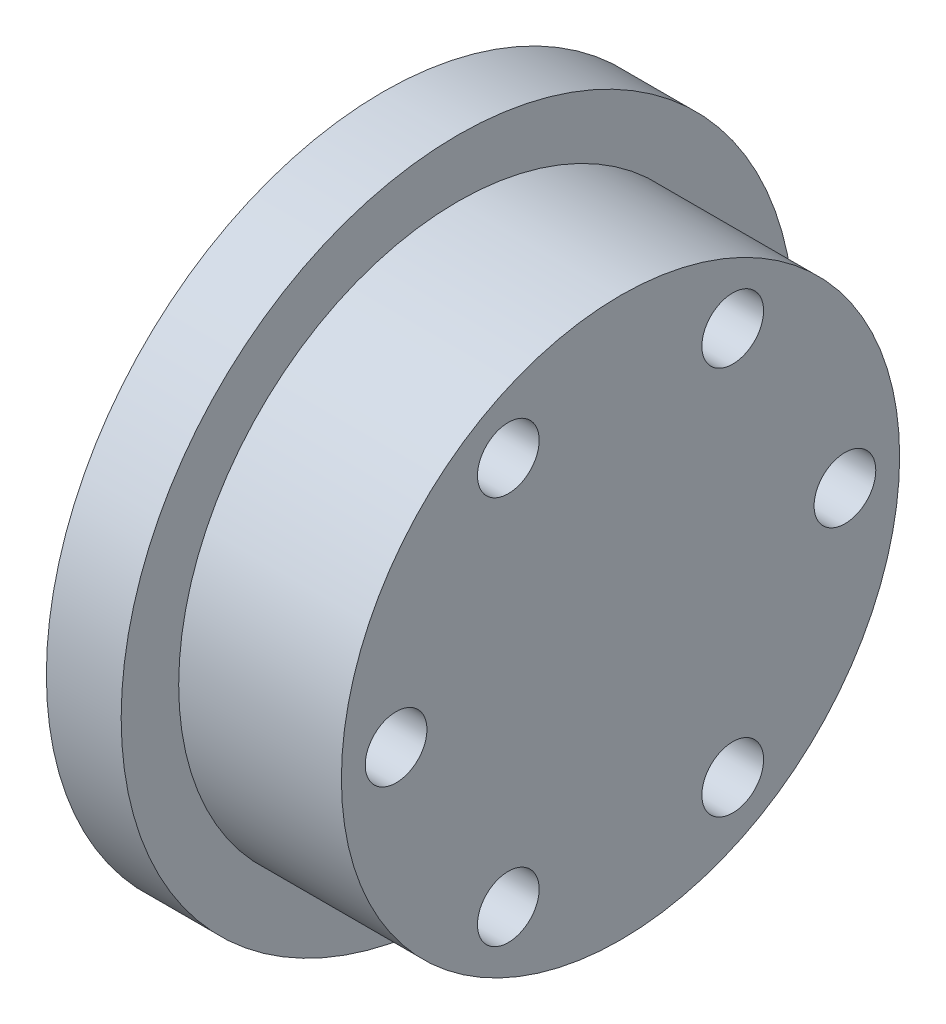
ISO-10303-21;
HEADER;
FILE_DESCRIPTION(('STEP AP214'),'2;1');
FILE_NAME('part.step','',(''),(''),'','','');
FILE_SCHEMA(('AUTOMOTIVE_DESIGN { 1 0 10303 214 1 1 1 1 }'));
ENDSEC;
DATA;
#1=APPLICATION_CONTEXT('core data for automotive mechanical design processes');
#2=APPLICATION_PROTOCOL_DEFINITION('international standard','automotive_design',2000,#1);
#3=PRODUCT_CONTEXT('',#1,'mechanical');
#4=PRODUCT('Part','Part','',(#3));
#5=PRODUCT_RELATED_PRODUCT_CATEGORY('part','',(#4));
#6=PRODUCT_DEFINITION_FORMATION('','',#4);
#7=PRODUCT_DEFINITION_CONTEXT('part definition',#1,'design');
#8=PRODUCT_DEFINITION('design','',#6,#7);
#9=PRODUCT_DEFINITION_SHAPE('','',#8);
#10=(LENGTH_UNIT() NAMED_UNIT(*) SI_UNIT(.MILLI.,.METRE.));
#11=(NAMED_UNIT(*) PLANE_ANGLE_UNIT() SI_UNIT($,.RADIAN.));
#12=(NAMED_UNIT(*) SI_UNIT($,.STERADIAN.) SOLID_ANGLE_UNIT());
#13=UNCERTAINTY_MEASURE_WITH_UNIT(LENGTH_MEASURE(1.E-05),#10,'distance_accuracy_value','');
#14=(GEOMETRIC_REPRESENTATION_CONTEXT(3) GLOBAL_UNCERTAINTY_ASSIGNED_CONTEXT((#13)) GLOBAL_UNIT_ASSIGNED_CONTEXT((#10,
#11,#12)) REPRESENTATION_CONTEXT('',''));
#15=CARTESIAN_POINT('',(0.,0.,0.));
#16=DIRECTION('',(0.,0.,1.));
#17=DIRECTION('',(1.,0.,0.));
#18=AXIS2_PLACEMENT_3D('',#15,#16,#17);
#19=CARTESIAN_POINT('',(4.,0.,0.));
#20=DIRECTION('',(-1.,0.,0.));
#21=DIRECTION('',(0.,0.,1.));
#22=AXIS2_PLACEMENT_3D('',#19,#20,#21);
#23=CYLINDRICAL_SURFACE('',#22,18.);
#24=CARTESIAN_POINT('',(4.,0.,0.));
#25=DIRECTION('',(1.,0.,0.));
#26=DIRECTION('',(0.,0.,-1.));
#27=AXIS2_PLACEMENT_3D('',#24,#25,#26);
#28=CIRCLE('',#27,18.);
#29=CARTESIAN_POINT('',(4.,0.,-18.));
#30=VERTEX_POINT('',#29);
#31=EDGE_CURVE('E51',#30,#30,#28,.T.);
#32=ORIENTED_EDGE('',*,*,#31,.F.);
#33=EDGE_LOOP('',(#32));
#34=FACE_BOUND('',#33,.T.);
#35=CARTESIAN_POINT('',(0.,0.,0.));
#36=DIRECTION('',(1.,0.,0.));
#37=DIRECTION('',(0.,0.,-1.));
#38=AXIS2_PLACEMENT_3D('',#35,#36,#37);
#39=CIRCLE('',#38,18.);
#40=CARTESIAN_POINT('',(0.,0.,-18.));
#41=VERTEX_POINT('',#40);
#42=EDGE_CURVE('E46',#41,#41,#39,.T.);
#43=ORIENTED_EDGE('',*,*,#42,.T.);
#44=EDGE_LOOP('',(#43));
#45=FACE_BOUND('',#44,.T.);
#46=ADVANCED_FACE('F43',(#34,#45),#23,.T.);
#47=CARTESIAN_POINT('',(4.,0.,0.));
#48=DIRECTION('',(1.,0.,0.));
#49=DIRECTION('',(0.,0.,-1.));
#50=AXIS2_PLACEMENT_3D('',#47,#48,#49);
#51=PLANE('',#50);
#52=CARTESIAN_POINT('',(4.,0.,0.));
#53=DIRECTION('',(1.,0.,0.));
#54=DIRECTION('',(0.,0.,-1.));
#55=AXIS2_PLACEMENT_3D('',#52,#53,#54);
#56=CIRCLE('',#55,14.925);
#57=CARTESIAN_POINT('',(4.,0.,-14.925));
#58=VERTEX_POINT('',#57);
#59=EDGE_CURVE('E10',#58,#58,#56,.T.);
#60=ORIENTED_EDGE('',*,*,#59,.F.);
#61=EDGE_LOOP('',(#60));
#62=FACE_BOUND('',#61,.T.);
#63=ORIENTED_EDGE('',*,*,#31,.T.);
#64=EDGE_LOOP('',(#63));
#65=FACE_BOUND('',#64,.T.);
#66=ADVANCED_FACE('F144',(#62,#65),#51,.T.);
#67=CARTESIAN_POINT('',(0.,0.,0.));
#68=DIRECTION('',(1.,0.,0.));
#69=DIRECTION('',(0.,0.,-1.));
#70=AXIS2_PLACEMENT_3D('',#67,#68,#69);
#71=PLANE('',#70);
#72=CARTESIAN_POINT('',(0.,0.,12.));
#73=DIRECTION('',(1.,0.,0.));
#74=DIRECTION('',(0.,0.,-1.));
#75=AXIS2_PLACEMENT_3D('',#72,#73,#74);
#76=CIRCLE('',#75,1.65);
#77=CARTESIAN_POINT('',(0.,0.,10.35));
#78=VERTEX_POINT('',#77);
#79=EDGE_CURVE('E65',#78,#78,#76,.T.);
#80=ORIENTED_EDGE('',*,*,#79,.T.);
#81=EDGE_LOOP('',(#80));
#82=FACE_BOUND('',#81,.T.);
#83=CARTESIAN_POINT('',(0.,-10.3923048454133,6.));
#84=DIRECTION('',(1.,0.,0.));
#85=DIRECTION('',(0.,0.,-1.));
#86=AXIS2_PLACEMENT_3D('',#83,#84,#85);
#87=CIRCLE('',#86,1.65);
#88=CARTESIAN_POINT('',(0.,-10.3923048454133,4.35));
#89=VERTEX_POINT('',#88);
#90=EDGE_CURVE('E100',#89,#89,#87,.T.);
#91=ORIENTED_EDGE('',*,*,#90,.T.);
#92=EDGE_LOOP('',(#91));
#93=FACE_BOUND('',#92,.T.);
#94=CARTESIAN_POINT('',(0.,-10.3923048454133,-6.00000000000001));
#95=DIRECTION('',(1.,0.,0.));
#96=DIRECTION('',(0.,0.,-1.));
#97=AXIS2_PLACEMENT_3D('',#94,#95,#96);
#98=CIRCLE('',#97,1.65);
#99=CARTESIAN_POINT('',(0.,-10.3923048454133,-7.65000000000001));
#100=VERTEX_POINT('',#99);
#101=EDGE_CURVE('E64',#100,#100,#98,.T.);
#102=ORIENTED_EDGE('',*,*,#101,.T.);
#103=EDGE_LOOP('',(#102));
#104=FACE_BOUND('',#103,.T.);
#105=CARTESIAN_POINT('',(0.,0.,-12.));
#106=DIRECTION('',(1.,0.,0.));
#107=DIRECTION('',(0.,0.,-1.));
#108=AXIS2_PLACEMENT_3D('',#105,#106,#107);
#109=CIRCLE('',#108,1.65);
#110=CARTESIAN_POINT('',(0.,0.,-13.65));
#111=VERTEX_POINT('',#110);
#112=EDGE_CURVE('E75',#111,#111,#109,.T.);
#113=ORIENTED_EDGE('',*,*,#112,.T.);
#114=EDGE_LOOP('',(#113));
#115=FACE_BOUND('',#114,.T.);
#116=CARTESIAN_POINT('',(0.,10.3923048454133,-6.));
#117=DIRECTION('',(1.,0.,0.));
#118=DIRECTION('',(0.,0.,-1.));
#119=AXIS2_PLACEMENT_3D('',#116,#117,#118);
#120=CIRCLE('',#119,1.65);
#121=CARTESIAN_POINT('',(0.,10.3923048454133,-7.65));
#122=VERTEX_POINT('',#121);
#123=EDGE_CURVE('E78',#122,#122,#120,.T.);
#124=ORIENTED_EDGE('',*,*,#123,.T.);
#125=EDGE_LOOP('',(#124));
#126=FACE_BOUND('',#125,.T.);
#127=CARTESIAN_POINT('',(0.,10.3923048454133,6.));
#128=DIRECTION('',(1.,0.,0.));
#129=DIRECTION('',(0.,0.,-1.));
#130=AXIS2_PLACEMENT_3D('',#127,#128,#129);
#131=CIRCLE('',#130,1.65);
#132=CARTESIAN_POINT('',(0.,10.3923048454133,4.35));
#133=VERTEX_POINT('',#132);
#134=EDGE_CURVE('E86',#133,#133,#131,.T.);
#135=ORIENTED_EDGE('',*,*,#134,.T.);
#136=EDGE_LOOP('',(#135));
#137=FACE_BOUND('',#136,.T.);
#138=ORIENTED_EDGE('',*,*,#42,.F.);
#139=EDGE_LOOP('',(#138));
#140=FACE_BOUND('',#139,.T.);
#141=ADVANCED_FACE('F112',(#82,#93,#104,#115,#126,#137,#140),#71,.F.);
#142=CARTESIAN_POINT('',(12.7,0.,0.));
#143=DIRECTION('',(-1.,0.,0.));
#144=DIRECTION('',(0.,0.,1.));
#145=AXIS2_PLACEMENT_3D('',#142,#143,#144);
#146=CYLINDRICAL_SURFACE('',#145,14.925);
#147=CARTESIAN_POINT('',(12.7,0.,0.));
#148=DIRECTION('',(1.,0.,0.));
#149=DIRECTION('',(0.,0.,-1.));
#150=AXIS2_PLACEMENT_3D('',#147,#148,#149);
#151=CIRCLE('',#150,14.925);
#152=CARTESIAN_POINT('',(12.7,0.,-14.925));
#153=VERTEX_POINT('',#152);
#154=EDGE_CURVE('E59',#153,#153,#151,.T.);
#155=ORIENTED_EDGE('',*,*,#154,.F.);
#156=EDGE_LOOP('',(#155));
#157=FACE_BOUND('',#156,.T.);
#158=ORIENTED_EDGE('',*,*,#59,.T.);
#159=EDGE_LOOP('',(#158));
#160=FACE_BOUND('',#159,.T.);
#161=ADVANCED_FACE('F122',(#157,#160),#146,.T.);
#162=CARTESIAN_POINT('',(12.7,0.,0.));
#163=DIRECTION('',(1.,0.,0.));
#164=DIRECTION('',(0.,0.,-1.));
#165=AXIS2_PLACEMENT_3D('',#162,#163,#164);
#166=PLANE('',#165);
#167=CARTESIAN_POINT('',(12.7,0.,12.));
#168=DIRECTION('',(1.,0.,0.));
#169=DIRECTION('',(0.,0.,-1.));
#170=AXIS2_PLACEMENT_3D('',#167,#168,#169);
#171=CIRCLE('',#170,1.65);
#172=CARTESIAN_POINT('',(12.7,0.,10.35));
#173=VERTEX_POINT('',#172);
#174=EDGE_CURVE('E96',#173,#173,#171,.T.);
#175=ORIENTED_EDGE('',*,*,#174,.F.);
#176=EDGE_LOOP('',(#175));
#177=FACE_BOUND('',#176,.T.);
#178=CARTESIAN_POINT('',(12.7,-10.3923048454133,6.));
#179=DIRECTION('',(1.,0.,0.));
#180=DIRECTION('',(0.,0.,-1.));
#181=AXIS2_PLACEMENT_3D('',#178,#179,#180);
#182=CIRCLE('',#181,1.65);
#183=CARTESIAN_POINT('',(12.7,-10.3923048454133,4.35));
#184=VERTEX_POINT('',#183);
#185=EDGE_CURVE('E70',#184,#184,#182,.T.);
#186=ORIENTED_EDGE('',*,*,#185,.F.);
#187=EDGE_LOOP('',(#186));
#188=FACE_BOUND('',#187,.T.);
#189=CARTESIAN_POINT('',(12.7,-10.3923048454133,-6.00000000000001));
#190=DIRECTION('',(1.,0.,0.));
#191=DIRECTION('',(0.,0.,-1.));
#192=AXIS2_PLACEMENT_3D('',#189,#190,#191);
#193=CIRCLE('',#192,1.65);
#194=CARTESIAN_POINT('',(12.7,-10.3923048454133,-7.65000000000001));
#195=VERTEX_POINT('',#194);
#196=EDGE_CURVE('E66',#195,#195,#193,.T.);
#197=ORIENTED_EDGE('',*,*,#196,.F.);
#198=EDGE_LOOP('',(#197));
#199=FACE_BOUND('',#198,.T.);
#200=CARTESIAN_POINT('',(12.7,0.,-12.));
#201=DIRECTION('',(1.,0.,0.));
#202=DIRECTION('',(0.,0.,-1.));
#203=AXIS2_PLACEMENT_3D('',#200,#201,#202);
#204=CIRCLE('',#203,1.65);
#205=CARTESIAN_POINT('',(12.7,0.,-13.65));
#206=VERTEX_POINT('',#205);
#207=EDGE_CURVE('E77',#206,#206,#204,.T.);
#208=ORIENTED_EDGE('',*,*,#207,.F.);
#209=EDGE_LOOP('',(#208));
#210=FACE_BOUND('',#209,.T.);
#211=CARTESIAN_POINT('',(12.7,10.3923048454133,-6.));
#212=DIRECTION('',(1.,0.,0.));
#213=DIRECTION('',(0.,0.,-1.));
#214=AXIS2_PLACEMENT_3D('',#211,#212,#213);
#215=CIRCLE('',#214,1.65);
#216=CARTESIAN_POINT('',(12.7,10.3923048454133,-7.65));
#217=VERTEX_POINT('',#216);
#218=EDGE_CURVE('E83',#217,#217,#215,.T.);
#219=ORIENTED_EDGE('',*,*,#218,.F.);
#220=EDGE_LOOP('',(#219));
#221=FACE_BOUND('',#220,.T.);
#222=CARTESIAN_POINT('',(12.7,10.3923048454133,6.));
#223=DIRECTION('',(1.,0.,0.));
#224=DIRECTION('',(0.,0.,-1.));
#225=AXIS2_PLACEMENT_3D('',#222,#223,#224);
#226=CIRCLE('',#225,1.65);
#227=CARTESIAN_POINT('',(12.7,10.3923048454133,4.35));
#228=VERTEX_POINT('',#227);
#229=EDGE_CURVE('E95',#228,#228,#226,.T.);
#230=ORIENTED_EDGE('',*,*,#229,.F.);
#231=EDGE_LOOP('',(#230));
#232=FACE_BOUND('',#231,.T.);
#233=ORIENTED_EDGE('',*,*,#154,.T.);
#234=EDGE_LOOP('',(#233));
#235=FACE_BOUND('',#234,.T.);
#236=ADVANCED_FACE('F124',(#177,#188,#199,#210,#221,#232,#235),#166,.T.);
#237=CARTESIAN_POINT('',(0.,10.3923048454133,6.));
#238=DIRECTION('',(1.,0.,0.));
#239=DIRECTION('',(0.,0.,-1.));
#240=AXIS2_PLACEMENT_3D('',#237,#238,#239);
#241=CYLINDRICAL_SURFACE('',#240,1.65);
#242=ORIENTED_EDGE('',*,*,#134,.F.);
#243=EDGE_LOOP('',(#242));
#244=FACE_BOUND('',#243,.T.);
#245=ORIENTED_EDGE('',*,*,#229,.T.);
#246=EDGE_LOOP('',(#245));
#247=FACE_BOUND('',#246,.T.);
#248=ADVANCED_FACE('F123',(#244,#247),#241,.F.);
#249=CARTESIAN_POINT('',(0.,10.3923048454133,-6.));
#250=DIRECTION('',(1.,0.,0.));
#251=DIRECTION('',(0.,0.,-1.));
#252=AXIS2_PLACEMENT_3D('',#249,#250,#251);
#253=CYLINDRICAL_SURFACE('',#252,1.65);
#254=ORIENTED_EDGE('',*,*,#123,.F.);
#255=EDGE_LOOP('',(#254));
#256=FACE_BOUND('',#255,.T.);
#257=ORIENTED_EDGE('',*,*,#218,.T.);
#258=EDGE_LOOP('',(#257));
#259=FACE_BOUND('',#258,.T.);
#260=ADVANCED_FACE('F188',(#256,#259),#253,.F.);
#261=CARTESIAN_POINT('',(0.,0.,-12.));
#262=DIRECTION('',(1.,0.,0.));
#263=DIRECTION('',(0.,0.,-1.));
#264=AXIS2_PLACEMENT_3D('',#261,#262,#263);
#265=CYLINDRICAL_SURFACE('',#264,1.65);
#266=ORIENTED_EDGE('',*,*,#112,.F.);
#267=EDGE_LOOP('',(#266));
#268=FACE_BOUND('',#267,.T.);
#269=ORIENTED_EDGE('',*,*,#207,.T.);
#270=EDGE_LOOP('',(#269));
#271=FACE_BOUND('',#270,.T.);
#272=ADVANCED_FACE('F199',(#268,#271),#265,.F.);
#273=CARTESIAN_POINT('',(0.,-10.3923048454133,-6.00000000000001));
#274=DIRECTION('',(1.,0.,0.));
#275=DIRECTION('',(0.,0.,-1.));
#276=AXIS2_PLACEMENT_3D('',#273,#274,#275);
#277=CYLINDRICAL_SURFACE('',#276,1.65);
#278=ORIENTED_EDGE('',*,*,#101,.F.);
#279=EDGE_LOOP('',(#278));
#280=FACE_BOUND('',#279,.T.);
#281=ORIENTED_EDGE('',*,*,#196,.T.);
#282=EDGE_LOOP('',(#281));
#283=FACE_BOUND('',#282,.T.);
#284=ADVANCED_FACE('F209',(#280,#283),#277,.F.);
#285=CARTESIAN_POINT('',(0.,-10.3923048454133,6.));
#286=DIRECTION('',(1.,0.,0.));
#287=DIRECTION('',(0.,0.,-1.));
#288=AXIS2_PLACEMENT_3D('',#285,#286,#287);
#289=CYLINDRICAL_SURFACE('',#288,1.65);
#290=ORIENTED_EDGE('',*,*,#90,.F.);
#291=EDGE_LOOP('',(#290));
#292=FACE_BOUND('',#291,.T.);
#293=ORIENTED_EDGE('',*,*,#185,.T.);
#294=EDGE_LOOP('',(#293));
#295=FACE_BOUND('',#294,.T.);
#296=ADVANCED_FACE('F120',(#292,#295),#289,.F.);
#297=CARTESIAN_POINT('',(0.,0.,12.));
#298=DIRECTION('',(1.,0.,0.));
#299=DIRECTION('',(0.,0.,-1.));
#300=AXIS2_PLACEMENT_3D('',#297,#298,#299);
#301=CYLINDRICAL_SURFACE('',#300,1.65);
#302=ORIENTED_EDGE('',*,*,#79,.F.);
#303=EDGE_LOOP('',(#302));
#304=FACE_BOUND('',#303,.T.);
#305=ORIENTED_EDGE('',*,*,#174,.T.);
#306=EDGE_LOOP('',(#305));
#307=FACE_BOUND('',#306,.T.);
#308=ADVANCED_FACE('F111',(#304,#307),#301,.F.);
#309=CLOSED_SHELL('',(#46,#66,#141,#161,#236,#248,#260,#272,#284,#296,#308));
#310=MANIFOLD_SOLID_BREP('B2',#309);
#311=ADVANCED_BREP_SHAPE_REPRESENTATION('',(#18,#310),#14);
#312=SHAPE_DEFINITION_REPRESENTATION(#9,#311);
ENDSEC;
END-ISO-10303-21;
